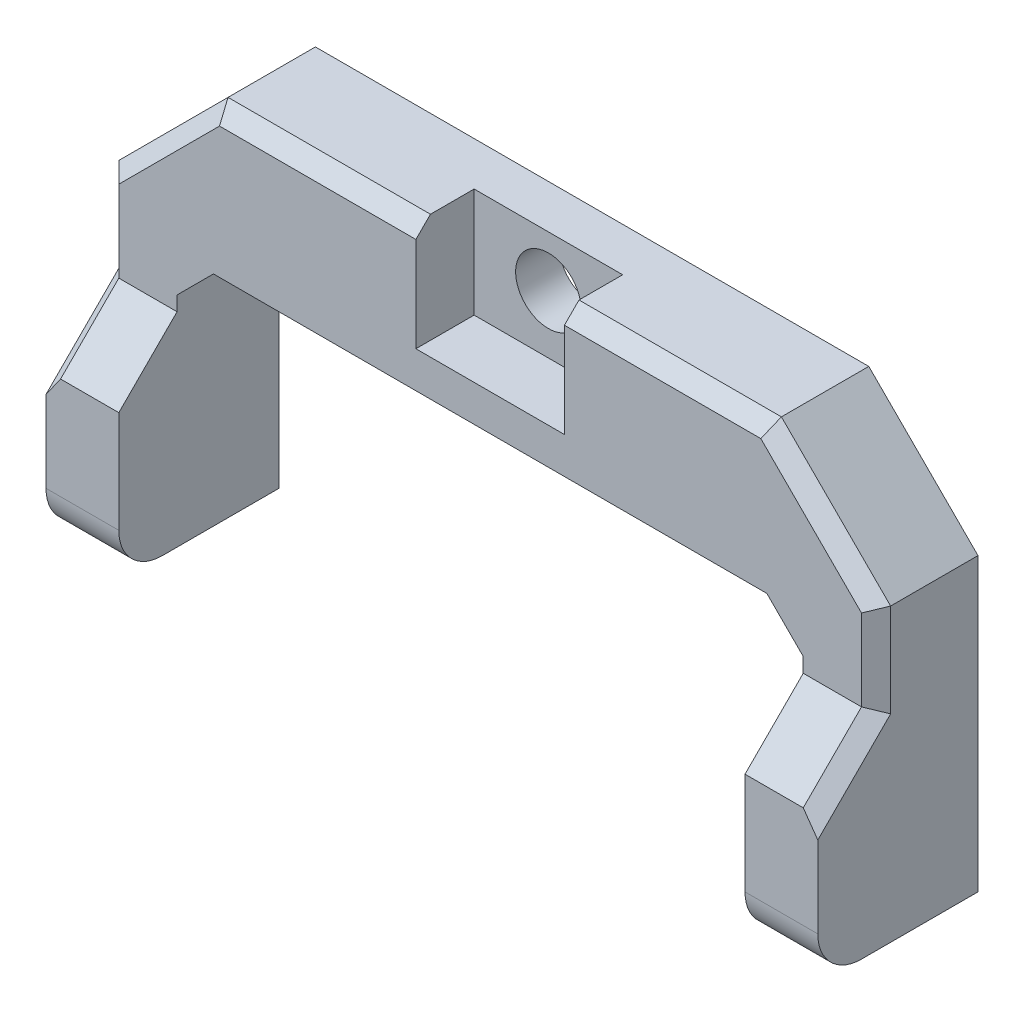
ISO-10303-21;
HEADER;
FILE_DESCRIPTION(('STEP AP214'),'2;1');
FILE_NAME('part.step','',(''),(''),'','','');
FILE_SCHEMA(('AUTOMOTIVE_DESIGN { 1 0 10303 214 1 1 1 1 }'));
ENDSEC;
DATA;
#1=APPLICATION_CONTEXT('core data for automotive mechanical design processes');
#2=APPLICATION_PROTOCOL_DEFINITION('international standard','automotive_design',2000,#1);
#3=PRODUCT_CONTEXT('',#1,'mechanical');
#4=PRODUCT('Part','Part','',(#3));
#5=PRODUCT_RELATED_PRODUCT_CATEGORY('part','',(#4));
#6=PRODUCT_DEFINITION_FORMATION('','',#4);
#7=PRODUCT_DEFINITION_CONTEXT('part definition',#1,'design');
#8=PRODUCT_DEFINITION('design','',#6,#7);
#9=PRODUCT_DEFINITION_SHAPE('','',#8);
#10=(LENGTH_UNIT() NAMED_UNIT(*) SI_UNIT(.MILLI.,.METRE.));
#11=(NAMED_UNIT(*) PLANE_ANGLE_UNIT() SI_UNIT($,.RADIAN.));
#12=(NAMED_UNIT(*) SI_UNIT($,.STERADIAN.) SOLID_ANGLE_UNIT());
#13=UNCERTAINTY_MEASURE_WITH_UNIT(LENGTH_MEASURE(1.E-05),#10,'distance_accuracy_value','');
#14=(GEOMETRIC_REPRESENTATION_CONTEXT(3) GLOBAL_UNCERTAINTY_ASSIGNED_CONTEXT((#13)) GLOBAL_UNIT_ASSIGNED_CONTEXT((#10,
#11,#12)) REPRESENTATION_CONTEXT('',''));
#15=CARTESIAN_POINT('',(0.,0.,0.));
#16=DIRECTION('',(0.,0.,1.));
#17=DIRECTION('',(1.,0.,0.));
#18=AXIS2_PLACEMENT_3D('',#15,#16,#17);
#19=CARTESIAN_POINT('',(-19.,0.,7.));
#20=DIRECTION('',(0.,-1.,0.));
#21=DIRECTION('',(0.,0.,-1.));
#22=AXIS2_PLACEMENT_3D('',#19,#20,#21);
#23=PLANE('',#22);
#24=DIRECTION('',(0.,0.,1.));
#25=VECTOR('',#24,1.);
#26=CARTESIAN_POINT('',(5.1,0.,3.));
#27=LINE('',#26,#25);
#28=CARTESIAN_POINT('',(5.1,0.,3.));
#29=VERTEX_POINT('',#28);
#30=CARTESIAN_POINT('',(5.1,0.,6.00000000000001));
#31=VERTEX_POINT('',#30);
#32=EDGE_CURVE('E239',#29,#31,#27,.T.);
#33=ORIENTED_EDGE('',*,*,#32,.T.);
#34=DIRECTION('',(1.,0.,0.));
#35=VECTOR('',#34,1.);
#36=CARTESIAN_POINT('',(19.,0.,6.00000000000001));
#37=LINE('',#36,#35);
#38=CARTESIAN_POINT('',(19.,0.,6.00000000000001));
#39=VERTEX_POINT('',#38);
#40=EDGE_CURVE('E442',#31,#39,#37,.T.);
#41=ORIENTED_EDGE('',*,*,#40,.T.);
#42=DIRECTION('',(0.,0.,-1.));
#43=VECTOR('',#42,1.);
#44=CARTESIAN_POINT('',(19.,0.,7.));
#45=LINE('',#44,#43);
#46=CARTESIAN_POINT('',(19.,0.,0.));
#47=VERTEX_POINT('',#46);
#48=EDGE_CURVE('E273',#39,#47,#45,.T.);
#49=ORIENTED_EDGE('',*,*,#48,.T.);
#50=DIRECTION('',(-1.,0.,0.));
#51=VECTOR('',#50,1.);
#52=CARTESIAN_POINT('',(-19.,0.,0.));
#53=LINE('',#52,#51);
#54=CARTESIAN_POINT('',(-19.,0.,0.));
#55=VERTEX_POINT('',#54);
#56=EDGE_CURVE('E351',#47,#55,#53,.T.);
#57=ORIENTED_EDGE('',*,*,#56,.T.);
#58=DIRECTION('',(0.,0.,-1.));
#59=VECTOR('',#58,1.);
#60=CARTESIAN_POINT('',(-19.,0.,7.));
#61=LINE('',#60,#59);
#62=CARTESIAN_POINT('',(-19.,0.,5.99999999999999));
#63=VERTEX_POINT('',#62);
#64=EDGE_CURVE('E388',#63,#55,#61,.T.);
#65=ORIENTED_EDGE('',*,*,#64,.F.);
#66=DIRECTION('',(1.,0.,0.));
#67=VECTOR('',#66,1.);
#68=CARTESIAN_POINT('',(-5.1,0.,5.99999999999999));
#69=LINE('',#68,#67);
#70=CARTESIAN_POINT('',(-5.1,0.,5.99999999999999));
#71=VERTEX_POINT('',#70);
#72=EDGE_CURVE('E439',#63,#71,#69,.T.);
#73=ORIENTED_EDGE('',*,*,#72,.T.);
#74=DIRECTION('',(0.,0.,1.));
#75=VECTOR('',#74,1.);
#76=CARTESIAN_POINT('',(-5.1,0.,3.));
#77=LINE('',#76,#75);
#78=CARTESIAN_POINT('',(-5.1,0.,3.));
#79=VERTEX_POINT('',#78);
#80=EDGE_CURVE('E230',#79,#71,#77,.T.);
#81=ORIENTED_EDGE('',*,*,#80,.F.);
#82=DIRECTION('',(-1.,0.,0.));
#83=VECTOR('',#82,1.);
#84=CARTESIAN_POINT('',(0.,0.,3.));
#85=LINE('',#84,#83);
#86=EDGE_CURVE('E311',#29,#79,#85,.T.);
#87=ORIENTED_EDGE('',*,*,#86,.F.);
#88=EDGE_LOOP('',(#33,#41,#49,#57,#65,#73,#81,#87));
#89=FACE_BOUND('',#88,.T.);
#90=ADVANCED_FACE('F41',(#89),#23,.F.);
#91=CARTESIAN_POINT('',(0.,0.,7.));
#92=DIRECTION('',(0.,0.,1.));
#93=DIRECTION('',(1.,0.,0.));
#94=AXIS2_PLACEMENT_3D('',#91,#92,#93);
#95=PLANE('',#94);
#96=DIRECTION('',(1.,0.,0.));
#97=VECTOR('',#96,1.);
#98=CARTESIAN_POINT('',(26.5,-13.5,7.));
#99=LINE('',#98,#97);
#100=CARTESIAN_POINT('',(21.5,-13.5,7.));
#101=VERTEX_POINT('',#100);
#102=CARTESIAN_POINT('',(25.5,-13.5,7.));
#103=VERTEX_POINT('',#102);
#104=EDGE_CURVE('E394',#101,#103,#99,.T.);
#105=ORIENTED_EDGE('',*,*,#104,.T.);
#106=DIRECTION('',(0.,1.,0.));
#107=VECTOR('',#106,1.);
#108=CARTESIAN_POINT('',(25.5,0.,7.));
#109=LINE('',#108,#107);
#110=CARTESIAN_POINT('',(25.5,-7.91421356237307,7.));
#111=VERTEX_POINT('',#110);
#112=EDGE_CURVE('E433',#103,#111,#109,.T.);
#113=ORIENTED_EDGE('',*,*,#112,.T.);
#114=DIRECTION('',(-0.707106781186549,0.707106781186546,0.));
#115=VECTOR('',#114,1.);
#116=CARTESIAN_POINT('',(8.79289321881342,8.79289321881345,7.));
#117=LINE('',#116,#115);
#118=CARTESIAN_POINT('',(18.5857864376269,-0.999999999999994,7.));
#119=VERTEX_POINT('',#118);
#120=EDGE_CURVE('E430',#111,#119,#117,.T.);
#121=ORIENTED_EDGE('',*,*,#120,.T.);
#122=DIRECTION('',(-1.,0.,0.));
#123=VECTOR('',#122,1.);
#124=CARTESIAN_POINT('',(5.1,-0.999999999999994,7.));
#125=LINE('',#124,#123);
#126=CARTESIAN_POINT('',(5.1,-0.999999999999994,7.));
#127=VERTEX_POINT('',#126);
#128=EDGE_CURVE('E427',#119,#127,#125,.T.);
#129=ORIENTED_EDGE('',*,*,#128,.T.);
#130=DIRECTION('',(0.,-1.,0.));
#131=VECTOR('',#130,1.);
#132=CARTESIAN_POINT('',(5.1,0.,7.));
#133=LINE('',#132,#131);
#134=CARTESIAN_POINT('',(5.1,-7.5,7.));
#135=VERTEX_POINT('',#134);
#136=EDGE_CURVE('E241',#127,#135,#133,.T.);
#137=ORIENTED_EDGE('',*,*,#136,.T.);
#138=DIRECTION('',(1.,0.,0.));
#139=VECTOR('',#138,1.);
#140=CARTESIAN_POINT('',(0.,-7.5,7.));
#141=LINE('',#140,#139);
#142=CARTESIAN_POINT('',(-5.1,-7.5,7.));
#143=VERTEX_POINT('',#142);
#144=EDGE_CURVE('E246',#143,#135,#141,.T.);
#145=ORIENTED_EDGE('',*,*,#144,.F.);
#146=DIRECTION('',(0.,-1.,0.));
#147=VECTOR('',#146,1.);
#148=CARTESIAN_POINT('',(-5.1,0.,7.));
#149=LINE('',#148,#147);
#150=CARTESIAN_POINT('',(-5.1,-1.00000000000001,7.));
#151=VERTEX_POINT('',#150);
#152=EDGE_CURVE('E310',#151,#143,#149,.T.);
#153=ORIENTED_EDGE('',*,*,#152,.F.);
#154=DIRECTION('',(-1.,0.,0.));
#155=VECTOR('',#154,1.);
#156=CARTESIAN_POINT('',(-19.,-1.00000000000001,7.));
#157=LINE('',#156,#155);
#158=CARTESIAN_POINT('',(-18.5857864376269,-1.00000000000001,7.));
#159=VERTEX_POINT('',#158);
#160=EDGE_CURVE('E418',#151,#159,#157,.T.);
#161=ORIENTED_EDGE('',*,*,#160,.T.);
#162=DIRECTION('',(-0.707106781186548,-0.707106781186547,0.));
#163=VECTOR('',#162,1.);
#164=CARTESIAN_POINT('',(-25.7928932188134,-8.20710678118654,7.));
#165=LINE('',#164,#163);
#166=CARTESIAN_POINT('',(-25.5,-7.91421356237308,7.));
#167=VERTEX_POINT('',#166);
#168=EDGE_CURVE('E421',#159,#167,#165,.T.);
#169=ORIENTED_EDGE('',*,*,#168,.T.);
#170=DIRECTION('',(0.,-1.,0.));
#171=VECTOR('',#170,1.);
#172=CARTESIAN_POINT('',(-25.5,-13.5,7.));
#173=LINE('',#172,#171);
#174=CARTESIAN_POINT('',(-25.5,-13.5,7.));
#175=VERTEX_POINT('',#174);
#176=EDGE_CURVE('E424',#167,#175,#173,.T.);
#177=ORIENTED_EDGE('',*,*,#176,.T.);
#178=DIRECTION('',(1.,0.,0.));
#179=VECTOR('',#178,1.);
#180=CARTESIAN_POINT('',(0.,-13.5,7.));
#181=LINE('',#180,#179);
#182=CARTESIAN_POINT('',(-21.5,-13.5,7.));
#183=VERTEX_POINT('',#182);
#184=EDGE_CURVE('E391',#175,#183,#181,.T.);
#185=ORIENTED_EDGE('',*,*,#184,.T.);
#186=DIRECTION('',(0.,1.,0.));
#187=VECTOR('',#186,1.);
#188=CARTESIAN_POINT('',(-21.5,-12.5,7.));
#189=LINE('',#188,#187);
#190=CARTESIAN_POINT('',(-21.5,-12.5,7.));
#191=VERTEX_POINT('',#190);
#192=EDGE_CURVE('E341',#183,#191,#189,.T.);
#193=ORIENTED_EDGE('',*,*,#192,.T.);
#194=DIRECTION('',(0.707106781186549,0.707106781186547,0.));
#195=VECTOR('',#194,1.);
#196=CARTESIAN_POINT('',(-19.,-10.,7.));
#197=LINE('',#196,#195);
#198=CARTESIAN_POINT('',(-19.,-10.,7.));
#199=VERTEX_POINT('',#198);
#200=EDGE_CURVE('E345',#191,#199,#197,.T.);
#201=ORIENTED_EDGE('',*,*,#200,.T.);
#202=DIRECTION('',(1.,0.,0.));
#203=VECTOR('',#202,1.);
#204=CARTESIAN_POINT('',(0.,-10.,7.));
#205=LINE('',#204,#203);
#206=CARTESIAN_POINT('',(19.,-10.,7.));
#207=VERTEX_POINT('',#206);
#208=EDGE_CURVE('E338',#199,#207,#205,.T.);
#209=ORIENTED_EDGE('',*,*,#208,.T.);
#210=DIRECTION('',(-0.707106781186549,0.707106781186546,0.));
#211=VECTOR('',#210,1.);
#212=CARTESIAN_POINT('',(19.,-10.,7.));
#213=LINE('',#212,#211);
#214=CARTESIAN_POINT('',(21.5,-12.5,7.));
#215=VERTEX_POINT('',#214);
#216=EDGE_CURVE('E265',#215,#207,#213,.T.);
#217=ORIENTED_EDGE('',*,*,#216,.F.);
#218=DIRECTION('',(0.,1.,0.));
#219=VECTOR('',#218,1.);
#220=CARTESIAN_POINT('',(21.5,-12.5,7.));
#221=LINE('',#220,#219);
#222=EDGE_CURVE('E269',#101,#215,#221,.T.);
#223=ORIENTED_EDGE('',*,*,#222,.F.);
#224=EDGE_LOOP('',(#105,#113,#121,#129,#137,#145,#153,#161,#169,#177,#185,#193,#201,#209,#217,#223));
#225=FACE_BOUND('',#224,.T.);
#226=ADVANCED_FACE('F541',(#225),#95,.T.);
#227=CARTESIAN_POINT('',(0.,-10.,7.));
#228=DIRECTION('',(0.,1.,0.));
#229=DIRECTION('',(-1.,0.,0.));
#230=AXIS2_PLACEMENT_3D('',#227,#228,#229);
#231=PLANE('',#230);
#232=DIRECTION('',(1.,0.,0.));
#233=VECTOR('',#232,1.);
#234=CARTESIAN_POINT('',(0.,-10.,0.));
#235=LINE('',#234,#233);
#236=CARTESIAN_POINT('',(-19.,-10.,0.));
#237=VERTEX_POINT('',#236);
#238=CARTESIAN_POINT('',(19.,-10.,0.));
#239=VERTEX_POINT('',#238);
#240=EDGE_CURVE('E337',#237,#239,#235,.T.);
#241=ORIENTED_EDGE('',*,*,#240,.T.);
#242=DIRECTION('',(0.,0.,-1.));
#243=VECTOR('',#242,1.);
#244=CARTESIAN_POINT('',(19.,-10.,7.));
#245=LINE('',#244,#243);
#246=EDGE_CURVE('E306',#207,#239,#245,.T.);
#247=ORIENTED_EDGE('',*,*,#246,.F.);
#248=ORIENTED_EDGE('',*,*,#208,.F.);
#249=DIRECTION('',(0.,0.,-1.));
#250=VECTOR('',#249,1.);
#251=CARTESIAN_POINT('',(-19.,-10.,7.));
#252=LINE('',#251,#250);
#253=EDGE_CURVE('E348',#199,#237,#252,.T.);
#254=ORIENTED_EDGE('',*,*,#253,.T.);
#255=EDGE_LOOP('',(#241,#247,#248,#254));
#256=FACE_BOUND('',#255,.T.);
#257=ADVANCED_FACE('F547',(#256),#231,.F.);
#258=CARTESIAN_POINT('',(-26.5,-7.49999999999999,7.));
#259=DIRECTION('',(0.707106781186547,-0.707106781186548,0.));
#260=DIRECTION('',(0.707106781186548,0.707106781186547,0.));
#261=AXIS2_PLACEMENT_3D('',#258,#259,#260);
#262=PLANE('',#261);
#263=DIRECTION('',(0.,0.,-1.));
#264=VECTOR('',#263,1.);
#265=CARTESIAN_POINT('',(-26.5,-7.49999999999999,7.));
#266=LINE('',#265,#264);
#267=CARTESIAN_POINT('',(-26.5,-7.49999999999999,5.99999999999999));
#268=VERTEX_POINT('',#267);
#269=CARTESIAN_POINT('',(-26.5,-7.49999999999999,0.));
#270=VERTEX_POINT('',#269);
#271=EDGE_CURVE('E385',#268,#270,#266,.T.);
#272=ORIENTED_EDGE('',*,*,#271,.F.);
#273=DIRECTION('',(0.707106781186548,0.707106781186547,0.));
#274=VECTOR('',#273,1.);
#275=CARTESIAN_POINT('',(-19.,0.,5.99999999999999));
#276=LINE('',#275,#274);
#277=EDGE_CURVE('E461',#268,#63,#276,.T.);
#278=ORIENTED_EDGE('',*,*,#277,.T.);
#279=ORIENTED_EDGE('',*,*,#64,.T.);
#280=DIRECTION('',(-0.707106781186548,-0.707106781186547,0.));
#281=VECTOR('',#280,1.);
#282=CARTESIAN_POINT('',(-26.5,-7.49999999999999,0.));
#283=LINE('',#282,#281);
#284=EDGE_CURVE('E355',#55,#270,#283,.T.);
#285=ORIENTED_EDGE('',*,*,#284,.T.);
#286=EDGE_LOOP('',(#272,#278,#279,#285));
#287=FACE_BOUND('',#286,.T.);
#288=ADVANCED_FACE('F552',(#287),#262,.F.);
#289=CARTESIAN_POINT('',(-26.5,-27.5,7.));
#290=DIRECTION('',(1.,0.,0.));
#291=DIRECTION('',(0.,0.,-1.));
#292=AXIS2_PLACEMENT_3D('',#289,#290,#291);
#293=PLANE('',#292);
#294=DIRECTION('',(0.,0.,-1.));
#295=VECTOR('',#294,1.);
#296=CARTESIAN_POINT('',(-26.5,-27.5,7.));
#297=LINE('',#296,#295);
#298=CARTESIAN_POINT('',(-26.5,-27.5,8.));
#299=VERTEX_POINT('',#298);
#300=CARTESIAN_POINT('',(-26.5,-27.5,0.));
#301=VERTEX_POINT('',#300);
#302=EDGE_CURVE('E382',#299,#301,#297,.T.);
#303=ORIENTED_EDGE('',*,*,#302,.F.);
#304=CARTESIAN_POINT('',(-26.5,-24.5,8.));
#305=DIRECTION('',(1.,0.,0.));
#306=DIRECTION('',(0.,0.,-1.));
#307=AXIS2_PLACEMENT_3D('',#304,#305,#306);
#308=CIRCLE('',#307,3.);
#309=CARTESIAN_POINT('',(-26.5,-24.5,11.));
#310=VERTEX_POINT('',#309);
#311=EDGE_CURVE('E11',#299,#310,#308,.F.);
#312=ORIENTED_EDGE('',*,*,#311,.T.);
#313=DIRECTION('',(0.,-1.,0.));
#314=VECTOR('',#313,1.);
#315=CARTESIAN_POINT('',(-26.5,-27.5,11.));
#316=LINE('',#315,#314);
#317=CARTESIAN_POINT('',(-26.5,-18.9142135623731,11.));
#318=VERTEX_POINT('',#317);
#319=EDGE_CURVE('E323',#318,#310,#316,.T.);
#320=ORIENTED_EDGE('',*,*,#319,.F.);
#321=DIRECTION('',(0.,0.707106781186547,-0.707106781186548));
#322=VECTOR('',#321,1.);
#323=CARTESIAN_POINT('',(-26.5,-21.2071067811865,13.2928932188134));
#324=LINE('',#323,#322);
#325=CARTESIAN_POINT('',(-26.5,-13.9142135623731,5.99999999999999));
#326=VERTEX_POINT('',#325);
#327=EDGE_CURVE('E451',#318,#326,#324,.T.);
#328=ORIENTED_EDGE('',*,*,#327,.T.);
#329=DIRECTION('',(0.,1.,0.));
#330=VECTOR('',#329,1.);
#331=CARTESIAN_POINT('',(-26.5,-7.49999999999999,5.99999999999999));
#332=LINE('',#331,#330);
#333=EDGE_CURVE('E448',#326,#268,#332,.T.);
#334=ORIENTED_EDGE('',*,*,#333,.T.);
#335=ORIENTED_EDGE('',*,*,#271,.T.);
#336=DIRECTION('',(0.,-1.,0.));
#337=VECTOR('',#336,1.);
#338=CARTESIAN_POINT('',(-26.5,-27.5,0.));
#339=LINE('',#338,#337);
#340=EDGE_CURVE('E359',#270,#301,#339,.T.);
#341=ORIENTED_EDGE('',*,*,#340,.T.);
#342=EDGE_LOOP('',(#303,#312,#320,#328,#334,#335,#341));
#343=FACE_BOUND('',#342,.T.);
#344=ADVANCED_FACE('F532',(#343),#293,.F.);
#345=CARTESIAN_POINT('',(-21.5,-27.5,7.));
#346=DIRECTION('',(0.,1.,0.));
#347=DIRECTION('',(-1.,0.,0.));
#348=AXIS2_PLACEMENT_3D('',#345,#346,#347);
#349=PLANE('',#348);
#350=DIRECTION('',(0.,0.,-1.));
#351=VECTOR('',#350,1.);
#352=CARTESIAN_POINT('',(-21.5,-27.5,7.));
#353=LINE('',#352,#351);
#354=CARTESIAN_POINT('',(-21.5,-27.5,8.));
#355=VERTEX_POINT('',#354);
#356=CARTESIAN_POINT('',(-21.5,-27.5,0.));
#357=VERTEX_POINT('',#356);
#358=EDGE_CURVE('E379',#355,#357,#353,.T.);
#359=ORIENTED_EDGE('',*,*,#358,.F.);
#360=DIRECTION('',(1.,0.,0.));
#361=VECTOR('',#360,1.);
#362=CARTESIAN_POINT('',(-21.5,-27.5,8.));
#363=LINE('',#362,#361);
#364=EDGE_CURVE('E50',#355,#299,#363,.F.);
#365=ORIENTED_EDGE('',*,*,#364,.T.);
#366=ORIENTED_EDGE('',*,*,#302,.T.);
#367=DIRECTION('',(1.,0.,0.));
#368=VECTOR('',#367,1.);
#369=CARTESIAN_POINT('',(-21.5,-27.5,0.));
#370=LINE('',#369,#368);
#371=EDGE_CURVE('E363',#301,#357,#370,.T.);
#372=ORIENTED_EDGE('',*,*,#371,.T.);
#373=EDGE_LOOP('',(#359,#365,#366,#372));
#374=FACE_BOUND('',#373,.T.);
#375=ADVANCED_FACE('F673',(#374),#349,.F.);
#376=CARTESIAN_POINT('',(-21.5,-12.5,7.));
#377=DIRECTION('',(-1.,0.,0.));
#378=DIRECTION('',(0.,-1.,0.));
#379=AXIS2_PLACEMENT_3D('',#376,#377,#378);
#380=PLANE('',#379);
#381=DIRECTION('',(0.,1.,0.));
#382=VECTOR('',#381,1.);
#383=CARTESIAN_POINT('',(-21.5,-27.5,11.));
#384=LINE('',#383,#382);
#385=CARTESIAN_POINT('',(-21.5,-24.5,11.));
#386=VERTEX_POINT('',#385);
#387=CARTESIAN_POINT('',(-21.5,-17.5,11.));
#388=VERTEX_POINT('',#387);
#389=EDGE_CURVE('E330',#386,#388,#384,.T.);
#390=ORIENTED_EDGE('',*,*,#389,.F.);
#391=CARTESIAN_POINT('',(-21.5,-24.5,8.));
#392=DIRECTION('',(-1.,0.,0.));
#393=DIRECTION('',(0.,-1.,0.));
#394=AXIS2_PLACEMENT_3D('',#391,#392,#393);
#395=CIRCLE('',#394,3.);
#396=EDGE_CURVE('E64',#386,#355,#395,.F.);
#397=ORIENTED_EDGE('',*,*,#396,.T.);
#398=ORIENTED_EDGE('',*,*,#358,.T.);
#399=DIRECTION('',(0.,1.,0.));
#400=VECTOR('',#399,1.);
#401=CARTESIAN_POINT('',(-21.5,-12.5,0.));
#402=LINE('',#401,#400);
#403=CARTESIAN_POINT('',(-21.5,-12.5,0.));
#404=VERTEX_POINT('',#403);
#405=EDGE_CURVE('E367',#357,#404,#402,.T.);
#406=ORIENTED_EDGE('',*,*,#405,.T.);
#407=DIRECTION('',(0.,0.,-1.));
#408=VECTOR('',#407,1.);
#409=CARTESIAN_POINT('',(-21.5,-12.5,7.));
#410=LINE('',#409,#408);
#411=EDGE_CURVE('E375',#191,#404,#410,.T.);
#412=ORIENTED_EDGE('',*,*,#411,.F.);
#413=ORIENTED_EDGE('',*,*,#192,.F.);
#414=DIRECTION('',(0.,-0.707106781186547,0.707106781186548));
#415=VECTOR('',#414,1.);
#416=CARTESIAN_POINT('',(-21.5,-13.,6.5));
#417=LINE('',#416,#415);
#418=EDGE_CURVE('E401',#183,#388,#417,.T.);
#419=ORIENTED_EDGE('',*,*,#418,.T.);
#420=EDGE_LOOP('',(#390,#397,#398,#406,#412,#413,#419));
#421=FACE_BOUND('',#420,.T.);
#422=ADVANCED_FACE('F516',(#421),#380,.F.);
#423=CARTESIAN_POINT('',(-19.,-10.,7.));
#424=DIRECTION('',(-0.707106781186546,0.707106781186548,0.));
#425=DIRECTION('',(-0.707106781186549,-0.707106781186547,0.));
#426=AXIS2_PLACEMENT_3D('',#423,#424,#425);
#427=PLANE('',#426);
#428=DIRECTION('',(0.707106781186549,0.707106781186547,0.));
#429=VECTOR('',#428,1.);
#430=CARTESIAN_POINT('',(-19.,-10.,0.));
#431=LINE('',#430,#429);
#432=EDGE_CURVE('E342',#404,#237,#431,.T.);
#433=ORIENTED_EDGE('',*,*,#432,.T.);
#434=ORIENTED_EDGE('',*,*,#253,.F.);
#435=ORIENTED_EDGE('',*,*,#200,.F.);
#436=ORIENTED_EDGE('',*,*,#411,.T.);
#437=EDGE_LOOP('',(#433,#434,#435,#436));
#438=FACE_BOUND('',#437,.T.);
#439=ADVANCED_FACE('F666',(#438),#427,.F.);
#440=CARTESIAN_POINT('',(0.,0.,0.));
#441=DIRECTION('',(0.,0.,1.));
#442=DIRECTION('',(1.,0.,0.));
#443=AXIS2_PLACEMENT_3D('',#440,#441,#442);
#444=PLANE('',#443);
#445=CARTESIAN_POINT('',(0.,-3.5,0.));
#446=DIRECTION('',(0.,0.,1.));
#447=DIRECTION('',(1.,0.,0.));
#448=AXIS2_PLACEMENT_3D('',#445,#446,#447);
#449=CIRCLE('',#448,2.25);
#450=CARTESIAN_POINT('',(2.25,-3.5,0.));
#451=VERTEX_POINT('',#450);
#452=EDGE_CURVE('E636',#451,#451,#449,.T.);
#453=ORIENTED_EDGE('',*,*,#452,.T.);
#454=EDGE_LOOP('',(#453));
#455=FACE_BOUND('',#454,.T.);
#456=ORIENTED_EDGE('',*,*,#240,.F.);
#457=ORIENTED_EDGE('',*,*,#432,.F.);
#458=ORIENTED_EDGE('',*,*,#405,.F.);
#459=ORIENTED_EDGE('',*,*,#371,.F.);
#460=ORIENTED_EDGE('',*,*,#340,.F.);
#461=ORIENTED_EDGE('',*,*,#284,.F.);
#462=ORIENTED_EDGE('',*,*,#56,.F.);
#463=DIRECTION('',(0.707106781186549,-0.707106781186546,0.));
#464=VECTOR('',#463,1.);
#465=CARTESIAN_POINT('',(26.5,-7.49999999999998,0.));
#466=LINE('',#465,#464);
#467=CARTESIAN_POINT('',(26.5,-7.49999999999998,0.));
#468=VERTEX_POINT('',#467);
#469=EDGE_CURVE('E270',#47,#468,#466,.T.);
#470=ORIENTED_EDGE('',*,*,#469,.T.);
#471=DIRECTION('',(0.,-1.,0.));
#472=VECTOR('',#471,1.);
#473=CARTESIAN_POINT('',(26.5,-27.5,0.));
#474=LINE('',#473,#472);
#475=CARTESIAN_POINT('',(26.5,-27.5,0.));
#476=VERTEX_POINT('',#475);
#477=EDGE_CURVE('E285',#468,#476,#474,.T.);
#478=ORIENTED_EDGE('',*,*,#477,.T.);
#479=DIRECTION('',(-1.,0.,0.));
#480=VECTOR('',#479,1.);
#481=CARTESIAN_POINT('',(21.5,-27.5,0.));
#482=LINE('',#481,#480);
#483=CARTESIAN_POINT('',(21.5,-27.5,0.));
#484=VERTEX_POINT('',#483);
#485=EDGE_CURVE('E281',#476,#484,#482,.T.);
#486=ORIENTED_EDGE('',*,*,#485,.T.);
#487=DIRECTION('',(0.,1.,0.));
#488=VECTOR('',#487,1.);
#489=CARTESIAN_POINT('',(21.5,-12.5,0.));
#490=LINE('',#489,#488);
#491=CARTESIAN_POINT('',(21.5,-12.5,0.));
#492=VERTEX_POINT('',#491);
#493=EDGE_CURVE('E277',#484,#492,#490,.T.);
#494=ORIENTED_EDGE('',*,*,#493,.T.);
#495=DIRECTION('',(-0.707106781186549,0.707106781186546,0.));
#496=VECTOR('',#495,1.);
#497=CARTESIAN_POINT('',(19.,-10.,0.));
#498=LINE('',#497,#496);
#499=EDGE_CURVE('E264',#492,#239,#498,.T.);
#500=ORIENTED_EDGE('',*,*,#499,.T.);
#501=EDGE_LOOP('',(#456,#457,#458,#459,#460,#461,#462,#470,#478,#486,#494,#500));
#502=FACE_BOUND('',#501,.T.);
#503=ADVANCED_FACE('F662',(#455,#502),#444,.F.);
#504=CARTESIAN_POINT('',(0.,0.,11.));
#505=DIRECTION('',(0.,0.,-1.));
#506=DIRECTION('',(-1.,0.,0.));
#507=AXIS2_PLACEMENT_3D('',#504,#505,#506);
#508=PLANE('',#507);
#509=ORIENTED_EDGE('',*,*,#319,.T.);
#510=DIRECTION('',(1.,0.,0.));
#511=VECTOR('',#510,1.);
#512=CARTESIAN_POINT('',(0.,-24.5,11.));
#513=LINE('',#512,#511);
#514=EDGE_CURVE('E504',#310,#386,#513,.T.);
#515=ORIENTED_EDGE('',*,*,#514,.T.);
#516=ORIENTED_EDGE('',*,*,#389,.T.);
#517=DIRECTION('',(-1.,0.,0.));
#518=VECTOR('',#517,1.);
#519=CARTESIAN_POINT('',(-26.5,-17.5,11.));
#520=LINE('',#519,#518);
#521=CARTESIAN_POINT('',(-25.5,-17.5,11.));
#522=VERTEX_POINT('',#521);
#523=EDGE_CURVE('E333',#388,#522,#520,.T.);
#524=ORIENTED_EDGE('',*,*,#523,.T.);
#525=DIRECTION('',(0.577350269189628,0.816496580927725,0.));
#526=VECTOR('',#525,1.);
#527=CARTESIAN_POINT('',(-27.5808802290397,-20.4428090415821,11.));
#528=LINE('',#527,#526);
#529=EDGE_CURVE('E458',#522,#318,#528,.F.);
#530=ORIENTED_EDGE('',*,*,#529,.T.);
#531=EDGE_LOOP('',(#509,#515,#516,#524,#530));
#532=FACE_BOUND('',#531,.T.);
#533=ADVANCED_FACE('F512',(#532),#508,.F.);
#534=CARTESIAN_POINT('',(0.,-7.5,3.));
#535=DIRECTION('',(0.,-1.,0.));
#536=DIRECTION('',(1.,0.,0.));
#537=AXIS2_PLACEMENT_3D('',#534,#535,#536);
#538=PLANE('',#537);
#539=ORIENTED_EDGE('',*,*,#144,.T.);
#540=DIRECTION('',(0.,0.,1.));
#541=VECTOR('',#540,1.);
#542=CARTESIAN_POINT('',(5.1,-7.5,3.));
#543=LINE('',#542,#541);
#544=CARTESIAN_POINT('',(5.1,-7.5,3.));
#545=VERTEX_POINT('',#544);
#546=EDGE_CURVE('E237',#545,#135,#543,.T.);
#547=ORIENTED_EDGE('',*,*,#546,.F.);
#548=DIRECTION('',(1.,0.,0.));
#549=VECTOR('',#548,1.);
#550=CARTESIAN_POINT('',(0.,-7.5,3.));
#551=LINE('',#550,#549);
#552=CARTESIAN_POINT('',(-5.1,-7.5,3.));
#553=VERTEX_POINT('',#552);
#554=EDGE_CURVE('E220',#553,#545,#551,.T.);
#555=ORIENTED_EDGE('',*,*,#554,.F.);
#556=DIRECTION('',(0.,0.,1.));
#557=VECTOR('',#556,1.);
#558=CARTESIAN_POINT('',(-5.1,-7.5,3.));
#559=LINE('',#558,#557);
#560=EDGE_CURVE('E320',#553,#143,#559,.T.);
#561=ORIENTED_EDGE('',*,*,#560,.T.);
#562=EDGE_LOOP('',(#539,#547,#555,#561));
#563=FACE_BOUND('',#562,.T.);
#564=ADVANCED_FACE('F244',(#563),#538,.F.);
#565=CARTESIAN_POINT('',(-5.1,0.,3.));
#566=DIRECTION('',(-1.,0.,0.));
#567=DIRECTION('',(0.,-1.,0.));
#568=AXIS2_PLACEMENT_3D('',#565,#566,#567);
#569=PLANE('',#568);
#570=ORIENTED_EDGE('',*,*,#80,.T.);
#571=DIRECTION('',(0.,-0.707106781186545,0.70710678118655));
#572=VECTOR('',#571,1.);
#573=CARTESIAN_POINT('',(-5.1,-1.00000000000001,7.));
#574=LINE('',#573,#572);
#575=EDGE_CURVE('E464',#71,#151,#574,.T.);
#576=ORIENTED_EDGE('',*,*,#575,.T.);
#577=ORIENTED_EDGE('',*,*,#152,.T.);
#578=ORIENTED_EDGE('',*,*,#560,.F.);
#579=DIRECTION('',(0.,-1.,0.));
#580=VECTOR('',#579,1.);
#581=CARTESIAN_POINT('',(-5.1,0.,3.));
#582=LINE('',#581,#580);
#583=EDGE_CURVE('E225',#79,#553,#582,.T.);
#584=ORIENTED_EDGE('',*,*,#583,.F.);
#585=EDGE_LOOP('',(#570,#576,#577,#578,#584));
#586=FACE_BOUND('',#585,.T.);
#587=ADVANCED_FACE('F631',(#586),#569,.F.);
#588=CARTESIAN_POINT('',(0.,0.,3.));
#589=DIRECTION('',(0.,0.,-1.));
#590=DIRECTION('',(-1.,0.,0.));
#591=AXIS2_PLACEMENT_3D('',#588,#589,#590);
#592=PLANE('',#591);
#593=CARTESIAN_POINT('',(0.,-3.5,3.));
#594=DIRECTION('',(0.,0.,1.));
#595=DIRECTION('',(1.,0.,0.));
#596=AXIS2_PLACEMENT_3D('',#593,#594,#595);
#597=CIRCLE('',#596,2.24999999999999);
#598=CARTESIAN_POINT('',(2.24999999999999,-3.5,3.));
#599=VERTEX_POINT('',#598);
#600=EDGE_CURVE('E481',#599,#599,#597,.T.);
#601=ORIENTED_EDGE('',*,*,#600,.F.);
#602=EDGE_LOOP('',(#601));
#603=FACE_BOUND('',#602,.T.);
#604=ORIENTED_EDGE('',*,*,#554,.T.);
#605=DIRECTION('',(0.,-1.,0.));
#606=VECTOR('',#605,1.);
#607=CARTESIAN_POINT('',(5.1,0.,3.));
#608=LINE('',#607,#606);
#609=EDGE_CURVE('E224',#29,#545,#608,.T.);
#610=ORIENTED_EDGE('',*,*,#609,.F.);
#611=ORIENTED_EDGE('',*,*,#86,.T.);
#612=ORIENTED_EDGE('',*,*,#583,.T.);
#613=EDGE_LOOP('',(#604,#610,#611,#612));
#614=FACE_BOUND('',#613,.T.);
#615=ADVANCED_FACE('F222',(#603,#614),#592,.F.);
#616=CARTESIAN_POINT('',(19.,-10.,7.));
#617=DIRECTION('',(-0.707106781186546,-0.707106781186549,0.));
#618=DIRECTION('',(0.707106781186549,-0.707106781186546,0.));
#619=AXIS2_PLACEMENT_3D('',#616,#617,#618);
#620=PLANE('',#619);
#621=ORIENTED_EDGE('',*,*,#499,.F.);
#622=DIRECTION('',(0.,0.,-1.));
#623=VECTOR('',#622,1.);
#624=CARTESIAN_POINT('',(21.5,-12.5,7.));
#625=LINE('',#624,#623);
#626=EDGE_CURVE('E303',#215,#492,#625,.T.);
#627=ORIENTED_EDGE('',*,*,#626,.F.);
#628=ORIENTED_EDGE('',*,*,#216,.T.);
#629=ORIENTED_EDGE('',*,*,#246,.T.);
#630=EDGE_LOOP('',(#621,#627,#628,#629));
#631=FACE_BOUND('',#630,.T.);
#632=ADVANCED_FACE('F647',(#631),#620,.T.);
#633=CARTESIAN_POINT('',(21.5,-12.5,7.));
#634=DIRECTION('',(-1.,0.,0.));
#635=DIRECTION('',(0.,-1.,0.));
#636=AXIS2_PLACEMENT_3D('',#633,#634,#635);
#637=PLANE('',#636);
#638=DIRECTION('',(0.,0.,-1.));
#639=VECTOR('',#638,1.);
#640=CARTESIAN_POINT('',(21.5,-27.5,7.));
#641=LINE('',#640,#639);
#642=CARTESIAN_POINT('',(21.5,-27.5,8.));
#643=VERTEX_POINT('',#642);
#644=EDGE_CURVE('E300',#643,#484,#641,.T.);
#645=ORIENTED_EDGE('',*,*,#644,.F.);
#646=CARTESIAN_POINT('',(21.5,-24.5,8.));
#647=DIRECTION('',(-1.,0.,0.));
#648=DIRECTION('',(0.,-1.,0.));
#649=AXIS2_PLACEMENT_3D('',#646,#647,#648);
#650=CIRCLE('',#649,3.);
#651=CARTESIAN_POINT('',(21.5,-24.5,11.));
#652=VERTEX_POINT('',#651);
#653=EDGE_CURVE('E495',#643,#652,#650,.T.);
#654=ORIENTED_EDGE('',*,*,#653,.T.);
#655=DIRECTION('',(0.,1.,0.));
#656=VECTOR('',#655,1.);
#657=CARTESIAN_POINT('',(21.5,-27.5,11.));
#658=LINE('',#657,#656);
#659=CARTESIAN_POINT('',(21.5,-17.5,11.));
#660=VERTEX_POINT('',#659);
#661=EDGE_CURVE('E261',#652,#660,#658,.T.);
#662=ORIENTED_EDGE('',*,*,#661,.T.);
#663=DIRECTION('',(0.,-0.707106781186547,0.707106781186548));
#664=VECTOR('',#663,1.);
#665=CARTESIAN_POINT('',(21.5,-13.5,7.));
#666=LINE('',#665,#664);
#667=EDGE_CURVE('E398',#660,#101,#666,.F.);
#668=ORIENTED_EDGE('',*,*,#667,.T.);
#669=ORIENTED_EDGE('',*,*,#222,.T.);
#670=ORIENTED_EDGE('',*,*,#626,.T.);
#671=ORIENTED_EDGE('',*,*,#493,.F.);
#672=EDGE_LOOP('',(#645,#654,#662,#668,#669,#670,#671));
#673=FACE_BOUND('',#672,.T.);
#674=ADVANCED_FACE('F653',(#673),#637,.T.);
#675=CARTESIAN_POINT('',(21.5,-27.5,7.));
#676=DIRECTION('',(0.,-1.,0.));
#677=DIRECTION('',(1.,0.,0.));
#678=AXIS2_PLACEMENT_3D('',#675,#676,#677);
#679=PLANE('',#678);
#680=DIRECTION('',(0.,0.,-1.));
#681=VECTOR('',#680,1.);
#682=CARTESIAN_POINT('',(26.5,-27.5,7.));
#683=LINE('',#682,#681);
#684=CARTESIAN_POINT('',(26.5,-27.5,8.));
#685=VERTEX_POINT('',#684);
#686=EDGE_CURVE('E297',#685,#476,#683,.T.);
#687=ORIENTED_EDGE('',*,*,#686,.F.);
#688=DIRECTION('',(-1.,0.,0.));
#689=VECTOR('',#688,1.);
#690=CARTESIAN_POINT('',(21.5,-27.5,8.));
#691=LINE('',#690,#689);
#692=EDGE_CURVE('E467',#685,#643,#691,.T.);
#693=ORIENTED_EDGE('',*,*,#692,.T.);
#694=ORIENTED_EDGE('',*,*,#644,.T.);
#695=ORIENTED_EDGE('',*,*,#485,.F.);
#696=EDGE_LOOP('',(#687,#693,#694,#695));
#697=FACE_BOUND('',#696,.T.);
#698=ADVANCED_FACE('F727',(#697),#679,.T.);
#699=CARTESIAN_POINT('',(26.5,-27.5,7.));
#700=DIRECTION('',(1.,0.,0.));
#701=DIRECTION('',(0.,1.,0.));
#702=AXIS2_PLACEMENT_3D('',#699,#700,#701);
#703=PLANE('',#702);
#704=DIRECTION('',(0.,-1.,0.));
#705=VECTOR('',#704,1.);
#706=CARTESIAN_POINT('',(26.5,-27.5,11.));
#707=LINE('',#706,#705);
#708=CARTESIAN_POINT('',(26.5,-18.9142135623731,11.));
#709=VERTEX_POINT('',#708);
#710=CARTESIAN_POINT('',(26.5,-24.5,11.));
#711=VERTEX_POINT('',#710);
#712=EDGE_CURVE('E250',#709,#711,#707,.T.);
#713=ORIENTED_EDGE('',*,*,#712,.T.);
#714=CARTESIAN_POINT('',(26.5,-24.5,8.));
#715=DIRECTION('',(1.,0.,0.));
#716=DIRECTION('',(0.,1.,0.));
#717=AXIS2_PLACEMENT_3D('',#714,#715,#716);
#718=CIRCLE('',#717,3.);
#719=EDGE_CURVE('E501',#711,#685,#718,.T.);
#720=ORIENTED_EDGE('',*,*,#719,.T.);
#721=ORIENTED_EDGE('',*,*,#686,.T.);
#722=ORIENTED_EDGE('',*,*,#477,.F.);
#723=DIRECTION('',(0.,0.,-1.));
#724=VECTOR('',#723,1.);
#725=CARTESIAN_POINT('',(26.5,-7.49999999999998,7.));
#726=LINE('',#725,#724);
#727=CARTESIAN_POINT('',(26.5,-7.49999999999998,6.00000000000001));
#728=VERTEX_POINT('',#727);
#729=EDGE_CURVE('E294',#728,#468,#726,.T.);
#730=ORIENTED_EDGE('',*,*,#729,.F.);
#731=DIRECTION('',(0.,-1.,0.));
#732=VECTOR('',#731,1.);
#733=CARTESIAN_POINT('',(26.5,-27.5,6.00000000000001));
#734=LINE('',#733,#732);
#735=CARTESIAN_POINT('',(26.5,-13.9142135623731,6.00000000000001));
#736=VERTEX_POINT('',#735);
#737=EDGE_CURVE('E405',#728,#736,#734,.T.);
#738=ORIENTED_EDGE('',*,*,#737,.T.);
#739=DIRECTION('',(0.,-0.707106781186547,0.707106781186548));
#740=VECTOR('',#739,1.);
#741=CARTESIAN_POINT('',(26.5,-18.2071067811865,10.2928932188135));
#742=LINE('',#741,#740);
#743=EDGE_CURVE('E408',#736,#709,#742,.T.);
#744=ORIENTED_EDGE('',*,*,#743,.T.);
#745=EDGE_LOOP('',(#713,#720,#721,#722,#730,#738,#744));
#746=FACE_BOUND('',#745,.T.);
#747=ADVANCED_FACE('F716',(#746),#703,.T.);
#748=CARTESIAN_POINT('',(26.5,-7.49999999999998,7.));
#749=DIRECTION('',(0.707106781186546,0.707106781186549,0.));
#750=DIRECTION('',(-0.707106781186549,0.707106781186546,0.));
#751=AXIS2_PLACEMENT_3D('',#748,#749,#750);
#752=PLANE('',#751);
#753=ORIENTED_EDGE('',*,*,#48,.F.);
#754=DIRECTION('',(0.707106781186549,-0.707106781186546,0.));
#755=VECTOR('',#754,1.);
#756=CARTESIAN_POINT('',(26.5,-7.49999999999998,6.00000000000001));
#757=LINE('',#756,#755);
#758=EDGE_CURVE('E436',#39,#728,#757,.T.);
#759=ORIENTED_EDGE('',*,*,#758,.T.);
#760=ORIENTED_EDGE('',*,*,#729,.T.);
#761=ORIENTED_EDGE('',*,*,#469,.F.);
#762=EDGE_LOOP('',(#753,#759,#760,#761));
#763=FACE_BOUND('',#762,.T.);
#764=ADVANCED_FACE('F737',(#763),#752,.T.);
#765=CARTESIAN_POINT('',(0.,0.,11.));
#766=DIRECTION('',(0.,0.,-1.));
#767=DIRECTION('',(1.,0.,0.));
#768=AXIS2_PLACEMENT_3D('',#765,#766,#767);
#769=PLANE('',#768);
#770=ORIENTED_EDGE('',*,*,#661,.F.);
#771=DIRECTION('',(-1.,0.,0.));
#772=VECTOR('',#771,1.);
#773=CARTESIAN_POINT('',(26.5,-24.5,11.));
#774=LINE('',#773,#772);
#775=EDGE_CURVE('E498',#652,#711,#774,.F.);
#776=ORIENTED_EDGE('',*,*,#775,.T.);
#777=ORIENTED_EDGE('',*,*,#712,.F.);
#778=DIRECTION('',(0.577350269189626,-0.816496580927726,0.));
#779=VECTOR('',#778,1.);
#780=CARTESIAN_POINT('',(27.5808802290398,-20.442809041582,11.));
#781=LINE('',#780,#779);
#782=CARTESIAN_POINT('',(25.5,-17.5,11.));
#783=VERTEX_POINT('',#782);
#784=EDGE_CURVE('E412',#709,#783,#781,.F.);
#785=ORIENTED_EDGE('',*,*,#784,.T.);
#786=DIRECTION('',(1.,0.,0.));
#787=VECTOR('',#786,1.);
#788=CARTESIAN_POINT('',(26.5,-17.5,11.));
#789=LINE('',#788,#787);
#790=EDGE_CURVE('E257',#660,#783,#789,.T.);
#791=ORIENTED_EDGE('',*,*,#790,.F.);
#792=EDGE_LOOP('',(#770,#776,#777,#785,#791));
#793=FACE_BOUND('',#792,.T.);
#794=ADVANCED_FACE('F720',(#793),#769,.F.);
#795=CARTESIAN_POINT('',(5.1,0.,3.));
#796=DIRECTION('',(-1.,0.,0.));
#797=DIRECTION('',(0.,-1.,0.));
#798=AXIS2_PLACEMENT_3D('',#795,#796,#797);
#799=PLANE('',#798);
#800=ORIENTED_EDGE('',*,*,#136,.F.);
#801=DIRECTION('',(0.,0.707106781186548,-0.707106781186548));
#802=VECTOR('',#801,1.);
#803=CARTESIAN_POINT('',(5.1,1.5,4.5));
#804=LINE('',#803,#802);
#805=EDGE_CURVE('E445',#127,#31,#804,.T.);
#806=ORIENTED_EDGE('',*,*,#805,.T.);
#807=ORIENTED_EDGE('',*,*,#32,.F.);
#808=ORIENTED_EDGE('',*,*,#609,.T.);
#809=ORIENTED_EDGE('',*,*,#546,.T.);
#810=EDGE_LOOP('',(#800,#806,#807,#808,#809));
#811=FACE_BOUND('',#810,.T.);
#812=ADVANCED_FACE('F236',(#811),#799,.T.);
#813=CARTESIAN_POINT('',(0.,-3.5,3.));
#814=DIRECTION('',(0.,0.,1.));
#815=DIRECTION('',(1.,0.,0.));
#816=AXIS2_PLACEMENT_3D('',#813,#814,#815);
#817=CYLINDRICAL_SURFACE('',#816,2.24999999999999);
#818=ORIENTED_EDGE('',*,*,#452,.F.);
#819=EDGE_LOOP('',(#818));
#820=FACE_BOUND('',#819,.T.);
#821=ORIENTED_EDGE('',*,*,#600,.T.);
#822=EDGE_LOOP('',(#821));
#823=FACE_BOUND('',#822,.T.);
#824=ADVANCED_FACE('F564',(#820,#823),#817,.F.);
#825=CARTESIAN_POINT('',(0.,-13.5,7.));
#826=DIRECTION('',(0.,0.707106781186548,0.707106781186547));
#827=DIRECTION('',(-1.,0.,0.));
#828=AXIS2_PLACEMENT_3D('',#825,#826,#827);
#829=PLANE('',#828);
#830=ORIENTED_EDGE('',*,*,#790,.T.);
#831=DIRECTION('',(0.,-0.707106781186547,0.707106781186548));
#832=VECTOR('',#831,1.);
#833=CARTESIAN_POINT('',(25.5,-13.5,7.));
#834=LINE('',#833,#832);
#835=EDGE_CURVE('E415',#783,#103,#834,.F.);
#836=ORIENTED_EDGE('',*,*,#835,.T.);
#837=ORIENTED_EDGE('',*,*,#104,.F.);
#838=ORIENTED_EDGE('',*,*,#667,.F.);
#839=EDGE_LOOP('',(#830,#836,#837,#838));
#840=FACE_BOUND('',#839,.T.);
#841=ADVANCED_FACE('F558',(#840),#829,.T.);
#842=CARTESIAN_POINT('',(-26.5,-17.5,11.));
#843=DIRECTION('',(0.,-0.707106781186548,-0.707106781186547));
#844=DIRECTION('',(-1.,0.,0.));
#845=AXIS2_PLACEMENT_3D('',#842,#843,#844);
#846=PLANE('',#845);
#847=ORIENTED_EDGE('',*,*,#184,.F.);
#848=DIRECTION('',(0.,-0.707106781186547,0.707106781186548));
#849=VECTOR('',#848,1.);
#850=CARTESIAN_POINT('',(-25.5,-17.5,11.));
#851=LINE('',#850,#849);
#852=EDGE_CURVE('E455',#175,#522,#851,.T.);
#853=ORIENTED_EDGE('',*,*,#852,.T.);
#854=ORIENTED_EDGE('',*,*,#523,.F.);
#855=ORIENTED_EDGE('',*,*,#418,.F.);
#856=EDGE_LOOP('',(#847,#853,#854,#855));
#857=FACE_BOUND('',#856,.T.);
#858=ADVANCED_FACE('F523',(#857),#846,.F.);
#859=CARTESIAN_POINT('',(-19.,0.,6.00000000000001));
#860=DIRECTION('',(0.,0.707106781186547,0.707106781186547));
#861=DIRECTION('',(-1.,0.,0.));
#862=AXIS2_PLACEMENT_3D('',#859,#860,#861);
#863=PLANE('',#862);
#864=ORIENTED_EDGE('',*,*,#805,.F.);
#865=ORIENTED_EDGE('',*,*,#128,.F.);
#866=DIRECTION('',(-0.281084637714818,-0.678598344545848,0.678598344545848));
#867=VECTOR('',#866,1.);
#868=CARTESIAN_POINT('',(15.9976742047477,-7.2482556535607,13.2482556535607));
#869=LINE('',#868,#867);
#870=EDGE_CURVE('E477',#39,#119,#869,.T.);
#871=ORIENTED_EDGE('',*,*,#870,.F.);
#872=ORIENTED_EDGE('',*,*,#40,.F.);
#873=EDGE_LOOP('',(#864,#865,#871,#872));
#874=FACE_BOUND('',#873,.T.);
#875=ADVANCED_FACE('F571',(#874),#863,.T.);
#876=CARTESIAN_POINT('',(26.5,-7.49999999999998,6.00000000000001));
#877=DIRECTION('',(-0.5,-0.500000000000001,-0.707106781186547));
#878=DIRECTION('',(0.707106781186549,-0.707106781186546,0.));
#879=AXIS2_PLACEMENT_3D('',#876,#877,#878);
#880=PLANE('',#879);
#881=ORIENTED_EDGE('',*,*,#870,.T.);
#882=ORIENTED_EDGE('',*,*,#120,.F.);
#883=DIRECTION('',(0.678598344545847,0.281084637714819,-0.678598344545847));
#884=VECTOR('',#883,1.);
#885=CARTESIAN_POINT('',(26.5,-7.49999999999998,6.00000000000001));
#886=LINE('',#885,#884);
#887=EDGE_CURVE('E472',#728,#111,#886,.F.);
#888=ORIENTED_EDGE('',*,*,#887,.F.);
#889=ORIENTED_EDGE('',*,*,#758,.F.);
#890=EDGE_LOOP('',(#881,#882,#888,#889));
#891=FACE_BOUND('',#890,.T.);
#892=ADVANCED_FACE('F588',(#891),#880,.F.);
#893=CARTESIAN_POINT('',(26.5,-27.5,6.00000000000001));
#894=DIRECTION('',(-0.707106781186547,0.,-0.707106781186548));
#895=DIRECTION('',(0.,-1.,0.));
#896=AXIS2_PLACEMENT_3D('',#893,#894,#895);
#897=PLANE('',#896);
#898=ORIENTED_EDGE('',*,*,#887,.T.);
#899=ORIENTED_EDGE('',*,*,#112,.F.);
#900=DIRECTION('',(0.678598344545847,-0.281084637714821,-0.678598344545847));
#901=VECTOR('',#900,1.);
#902=CARTESIAN_POINT('',(24.532726422712,-13.0993421657622,7.967273577288));
#903=LINE('',#902,#901);
#904=EDGE_CURVE('E468',#736,#103,#903,.F.);
#905=ORIENTED_EDGE('',*,*,#904,.F.);
#906=ORIENTED_EDGE('',*,*,#737,.F.);
#907=EDGE_LOOP('',(#898,#899,#905,#906));
#908=FACE_BOUND('',#907,.T.);
#909=ADVANCED_FACE('F581',(#908),#897,.F.);
#910=CARTESIAN_POINT('',(26.5,-21.2071067811865,13.2928932188135));
#911=DIRECTION('',(-0.707106781186548,-0.500000000000001,-0.499999999999999));
#912=DIRECTION('',(0.,-0.707106781186547,0.707106781186548));
#913=AXIS2_PLACEMENT_3D('',#910,#911,#912);
#914=PLANE('',#913);
#915=ORIENTED_EDGE('',*,*,#904,.T.);
#916=ORIENTED_EDGE('',*,*,#835,.F.);
#917=ORIENTED_EDGE('',*,*,#784,.F.);
#918=ORIENTED_EDGE('',*,*,#743,.F.);
#919=EDGE_LOOP('',(#915,#916,#917,#918));
#920=FACE_BOUND('',#919,.T.);
#921=ADVANCED_FACE('F573',(#920),#914,.F.);
#922=CARTESIAN_POINT('',(0.,-1.00000000000001,7.));
#923=DIRECTION('',(0.,0.70710678118655,0.707106781186545));
#924=DIRECTION('',(1.,0.,0.));
#925=AXIS2_PLACEMENT_3D('',#922,#923,#924);
#926=PLANE('',#925);
#927=ORIENTED_EDGE('',*,*,#575,.F.);
#928=ORIENTED_EDGE('',*,*,#72,.F.);
#929=DIRECTION('',(0.28108463771482,-0.678598344545845,0.678598344545849));
#930=VECTOR('',#929,1.);
#931=CARTESIAN_POINT('',(-17.1173499627127,-4.5451192532211,10.5451192532211));
#932=LINE('',#931,#930);
#933=EDGE_CURVE('E473',#159,#63,#932,.F.);
#934=ORIENTED_EDGE('',*,*,#933,.F.);
#935=ORIENTED_EDGE('',*,*,#160,.F.);
#936=EDGE_LOOP('',(#927,#928,#934,#935));
#937=FACE_BOUND('',#936,.T.);
#938=ADVANCED_FACE('F580',(#937),#926,.T.);
#939=CARTESIAN_POINT('',(-8.79289321881342,8.79289321881344,7.));
#940=DIRECTION('',(-0.500000000000001,0.500000000000002,0.707106781186546));
#941=DIRECTION('',(0.707106781186548,0.707106781186547,0.));
#942=AXIS2_PLACEMENT_3D('',#939,#940,#941);
#943=PLANE('',#942);
#944=ORIENTED_EDGE('',*,*,#933,.T.);
#945=ORIENTED_EDGE('',*,*,#277,.F.);
#946=DIRECTION('',(0.678598344545844,-0.281084637714821,0.678598344545849));
#947=VECTOR('',#946,1.);
#948=CARTESIAN_POINT('',(-20.9932221359324,-9.78098207627274,11.5067778640676));
#949=LINE('',#948,#947);
#950=EDGE_CURVE('E485',#167,#268,#949,.F.);
#951=ORIENTED_EDGE('',*,*,#950,.F.);
#952=ORIENTED_EDGE('',*,*,#168,.F.);
#953=EDGE_LOOP('',(#944,#945,#951,#952));
#954=FACE_BOUND('',#953,.T.);
#955=ADVANCED_FACE('F612',(#954),#943,.T.);
#956=CARTESIAN_POINT('',(-25.5,0.,7.));
#957=DIRECTION('',(-0.70710678118655,0.,0.707106781186545));
#958=DIRECTION('',(0.,1.,0.));
#959=AXIS2_PLACEMENT_3D('',#956,#957,#958);
#960=PLANE('',#959);
#961=ORIENTED_EDGE('',*,*,#950,.T.);
#962=ORIENTED_EDGE('',*,*,#333,.F.);
#963=DIRECTION('',(-0.678598344545846,-0.281084637714812,-0.678598344545851));
#964=VECTOR('',#963,1.);
#965=CARTESIAN_POINT('',(-24.5327264227119,-13.0993421657622,7.96727357728806));
#966=LINE('',#965,#964);
#967=EDGE_CURVE('E482',#175,#326,#966,.T.);
#968=ORIENTED_EDGE('',*,*,#967,.F.);
#969=ORIENTED_EDGE('',*,*,#176,.F.);
#970=EDGE_LOOP('',(#961,#962,#968,#969));
#971=FACE_BOUND('',#970,.T.);
#972=ADVANCED_FACE('F606',(#971),#960,.T.);
#973=CARTESIAN_POINT('',(-26.5,-21.2071067811865,13.2928932188134));
#974=DIRECTION('',(0.707106781186546,-0.500000000000001,-0.5));
#975=DIRECTION('',(0.,0.707106781186547,-0.707106781186548));
#976=AXIS2_PLACEMENT_3D('',#973,#974,#975);
#977=PLANE('',#976);
#978=ORIENTED_EDGE('',*,*,#529,.F.);
#979=ORIENTED_EDGE('',*,*,#852,.F.);
#980=ORIENTED_EDGE('',*,*,#967,.T.);
#981=ORIENTED_EDGE('',*,*,#327,.F.);
#982=EDGE_LOOP('',(#978,#979,#980,#981));
#983=FACE_BOUND('',#982,.T.);
#984=ADVANCED_FACE('F528',(#983),#977,.F.);
#985=CARTESIAN_POINT('',(21.5,-24.5,8.));
#986=DIRECTION('',(1.,0.,0.));
#987=DIRECTION('',(0.,1.,0.));
#988=AXIS2_PLACEMENT_3D('',#985,#986,#987);
#989=CYLINDRICAL_SURFACE('',#988,3.);
#990=ORIENTED_EDGE('',*,*,#719,.F.);
#991=ORIENTED_EDGE('',*,*,#775,.F.);
#992=ORIENTED_EDGE('',*,*,#653,.F.);
#993=ORIENTED_EDGE('',*,*,#692,.F.);
#994=EDGE_LOOP('',(#990,#991,#992,#993));
#995=FACE_BOUND('',#994,.T.);
#996=ADVANCED_FACE('F535',(#995),#989,.T.);
#997=CARTESIAN_POINT('',(0.,-24.5,8.));
#998=DIRECTION('',(1.,0.,0.));
#999=DIRECTION('',(0.,1.,0.));
#1000=AXIS2_PLACEMENT_3D('',#997,#998,#999);
#1001=CYLINDRICAL_SURFACE('',#1000,3.);
#1002=ORIENTED_EDGE('',*,*,#311,.F.);
#1003=ORIENTED_EDGE('',*,*,#364,.F.);
#1004=ORIENTED_EDGE('',*,*,#396,.F.);
#1005=ORIENTED_EDGE('',*,*,#514,.F.);
#1006=EDGE_LOOP('',(#1002,#1003,#1004,#1005));
#1007=FACE_BOUND('',#1006,.T.);
#1008=ADVANCED_FACE('F43',(#1007),#1001,.T.);
#1009=CLOSED_SHELL('',(#90,#226,#257,#288,#344,#375,#422,#439,#503,#533,#564,#587,#615,#632,
#674,#698,#747,#764,#794,#812,#824,#841,#858,#875,#892,#909,#921,#938,#955,#972,#984,#996,#1008));
#1010=MANIFOLD_SOLID_BREP('B2',#1009);
#1011=ADVANCED_BREP_SHAPE_REPRESENTATION('',(#18,#1010),#14);
#1012=SHAPE_DEFINITION_REPRESENTATION(#9,#1011);
ENDSEC;
END-ISO-10303-21;
